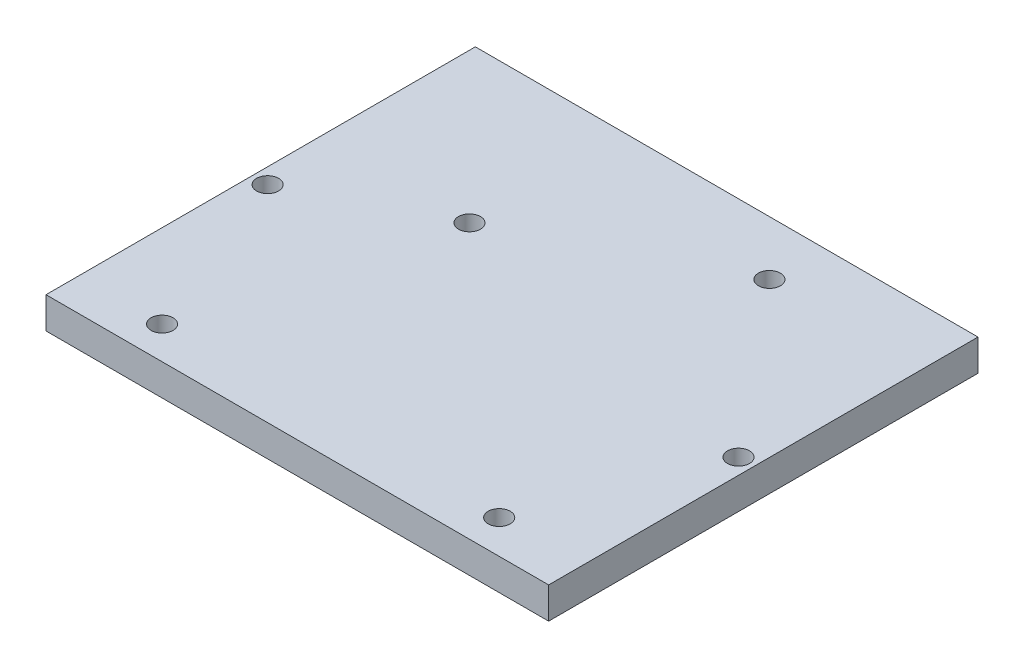
ISO-10303-21;
HEADER;
FILE_DESCRIPTION(('STEP AP214'),'2;1');
FILE_NAME('part.step','',(''),(''),'','','');
FILE_SCHEMA(('AUTOMOTIVE_DESIGN { 1 0 10303 214 1 1 1 1 }'));
ENDSEC;
DATA;
#1=APPLICATION_CONTEXT('core data for automotive mechanical design processes');
#2=APPLICATION_PROTOCOL_DEFINITION('international standard','automotive_design',2000,#1);
#3=PRODUCT_CONTEXT('',#1,'mechanical');
#4=PRODUCT('Part','Part','',(#3));
#5=PRODUCT_RELATED_PRODUCT_CATEGORY('part','',(#4));
#6=PRODUCT_DEFINITION_FORMATION('','',#4);
#7=PRODUCT_DEFINITION_CONTEXT('part definition',#1,'design');
#8=PRODUCT_DEFINITION('design','',#6,#7);
#9=PRODUCT_DEFINITION_SHAPE('','',#8);
#10=(LENGTH_UNIT() NAMED_UNIT(*) SI_UNIT(.MILLI.,.METRE.));
#11=(NAMED_UNIT(*) PLANE_ANGLE_UNIT() SI_UNIT($,.RADIAN.));
#12=(NAMED_UNIT(*) SI_UNIT($,.STERADIAN.) SOLID_ANGLE_UNIT());
#13=UNCERTAINTY_MEASURE_WITH_UNIT(LENGTH_MEASURE(1.E-05),#10,'distance_accuracy_value','');
#14=(GEOMETRIC_REPRESENTATION_CONTEXT(3) GLOBAL_UNCERTAINTY_ASSIGNED_CONTEXT((#13)) GLOBAL_UNIT_ASSIGNED_CONTEXT((#10,
#11,#12)) REPRESENTATION_CONTEXT('',''));
#15=CARTESIAN_POINT('',(0.,0.,0.));
#16=DIRECTION('',(0.,0.,1.));
#17=DIRECTION('',(1.,0.,0.));
#18=AXIS2_PLACEMENT_3D('',#15,#16,#17);
#19=CARTESIAN_POINT('',(0.,3.,0.));
#20=DIRECTION('',(0.,-1.,0.));
#21=DIRECTION('',(0.,0.,-1.));
#22=AXIS2_PLACEMENT_3D('',#19,#20,#21);
#23=PLANE('',#22);
#24=DIRECTION('',(0.,0.,1.));
#25=VECTOR('',#24,1.);
#26=CARTESIAN_POINT('',(0.,3.,0.));
#27=LINE('',#26,#25);
#28=CARTESIAN_POINT('',(0.,3.,-41.));
#29=VERTEX_POINT('',#28);
#30=CARTESIAN_POINT('',(0.,3.,0.));
#31=VERTEX_POINT('',#30);
#32=EDGE_CURVE('E92',#29,#31,#27,.T.);
#33=ORIENTED_EDGE('',*,*,#32,.T.);
#34=DIRECTION('',(1.,0.,0.));
#35=VECTOR('',#34,1.);
#36=CARTESIAN_POINT('',(0.,3.,0.));
#37=LINE('',#36,#35);
#38=CARTESIAN_POINT('',(48.,3.,0.));
#39=VERTEX_POINT('',#38);
#40=EDGE_CURVE('E87',#31,#39,#37,.T.);
#41=ORIENTED_EDGE('',*,*,#40,.T.);
#42=DIRECTION('',(0.,0.,-1.));
#43=VECTOR('',#42,1.);
#44=CARTESIAN_POINT('',(48.,3.,0.));
#45=LINE('',#44,#43);
#46=CARTESIAN_POINT('',(48.,3.,-41.));
#47=VERTEX_POINT('',#46);
#48=EDGE_CURVE('E90',#39,#47,#45,.T.);
#49=ORIENTED_EDGE('',*,*,#48,.T.);
#50=DIRECTION('',(-1.,0.,0.));
#51=VECTOR('',#50,1.);
#52=CARTESIAN_POINT('',(0.,3.,-41.));
#53=LINE('',#52,#51);
#54=EDGE_CURVE('E57',#47,#29,#53,.T.);
#55=ORIENTED_EDGE('',*,*,#54,.T.);
#56=EDGE_LOOP('',(#33,#41,#49,#55));
#57=FACE_BOUND('',#56,.T.);
#58=CARTESIAN_POINT('',(7.97,3.,-3.11));
#59=DIRECTION('',(0.,1.,0.));
#60=DIRECTION('',(0.,0.,1.));
#61=AXIS2_PLACEMENT_3D('',#58,#59,#60);
#62=CIRCLE('',#61,1.05);
#63=CARTESIAN_POINT('',(7.97,3.,-2.06));
#64=VERTEX_POINT('',#63);
#65=EDGE_CURVE('E112',#64,#64,#62,.T.);
#66=ORIENTED_EDGE('',*,*,#65,.F.);
#67=EDGE_LOOP('',(#66));
#68=FACE_BOUND('',#67,.T.);
#69=CARTESIAN_POINT('',(1.48,3.,-19.68));
#70=DIRECTION('',(0.,1.,0.));
#71=DIRECTION('',(0.,0.,1.));
#72=AXIS2_PLACEMENT_3D('',#69,#70,#71);
#73=CIRCLE('',#72,1.05);
#74=CARTESIAN_POINT('',(1.48,3.,-18.63));
#75=VERTEX_POINT('',#74);
#76=EDGE_CURVE('E134',#75,#75,#73,.T.);
#77=ORIENTED_EDGE('',*,*,#76,.F.);
#78=EDGE_LOOP('',(#77));
#79=FACE_BOUND('',#78,.T.);
#80=CARTESIAN_POINT('',(14.28,3.,-26.16));
#81=DIRECTION('',(0.,1.,0.));
#82=DIRECTION('',(0.,0.,1.));
#83=AXIS2_PLACEMENT_3D('',#80,#81,#82);
#84=CIRCLE('',#83,1.05);
#85=CARTESIAN_POINT('',(14.28,3.,-25.11));
#86=VERTEX_POINT('',#85);
#87=EDGE_CURVE('E142',#86,#86,#84,.T.);
#88=ORIENTED_EDGE('',*,*,#87,.F.);
#89=EDGE_LOOP('',(#88));
#90=FACE_BOUND('',#89,.T.);
#91=CARTESIAN_POINT('',(40.07,3.,-3.21));
#92=DIRECTION('',(0.,1.,0.));
#93=DIRECTION('',(0.,0.,1.));
#94=AXIS2_PLACEMENT_3D('',#91,#92,#93);
#95=CIRCLE('',#94,1.05);
#96=CARTESIAN_POINT('',(40.07,3.,-2.16));
#97=VERTEX_POINT('',#96);
#98=EDGE_CURVE('E150',#97,#97,#95,.T.);
#99=ORIENTED_EDGE('',*,*,#98,.F.);
#100=EDGE_LOOP('',(#99));
#101=FACE_BOUND('',#100,.T.);
#102=CARTESIAN_POINT('',(46.5,3.,-19.63));
#103=DIRECTION('',(0.,1.,0.));
#104=DIRECTION('',(0.,0.,1.));
#105=AXIS2_PLACEMENT_3D('',#102,#103,#104);
#106=CIRCLE('',#105,1.05);
#107=CARTESIAN_POINT('',(46.5,3.,-18.58));
#108=VERTEX_POINT('',#107);
#109=EDGE_CURVE('E158',#108,#108,#106,.T.);
#110=ORIENTED_EDGE('',*,*,#109,.F.);
#111=EDGE_LOOP('',(#110));
#112=FACE_BOUND('',#111,.T.);
#113=CARTESIAN_POINT('',(33.28,3.,-35.8));
#114=DIRECTION('',(0.,1.,0.));
#115=DIRECTION('',(0.,0.,1.));
#116=AXIS2_PLACEMENT_3D('',#113,#114,#115);
#117=CIRCLE('',#116,1.05);
#118=CARTESIAN_POINT('',(33.28,3.,-34.75));
#119=VERTEX_POINT('',#118);
#120=EDGE_CURVE('E166',#119,#119,#117,.T.);
#121=ORIENTED_EDGE('',*,*,#120,.F.);
#122=EDGE_LOOP('',(#121));
#123=FACE_BOUND('',#122,.T.);
#124=ADVANCED_FACE('F39',(#57,#68,#79,#90,#101,#112,#123),#23,.F.);
#125=CARTESIAN_POINT('',(0.,0.,0.));
#126=DIRECTION('',(0.,-1.,0.));
#127=DIRECTION('',(0.,0.,-1.));
#128=AXIS2_PLACEMENT_3D('',#125,#126,#127);
#129=PLANE('',#128);
#130=CARTESIAN_POINT('',(46.5,0.,-19.63));
#131=DIRECTION('',(0.,1.,0.));
#132=DIRECTION('',(0.,0.,1.));
#133=AXIS2_PLACEMENT_3D('',#130,#131,#132);
#134=CIRCLE('',#133,1.05);
#135=CARTESIAN_POINT('',(46.5,0.,-18.58));
#136=VERTEX_POINT('',#135);
#137=EDGE_CURVE('E162',#136,#136,#134,.T.);
#138=ORIENTED_EDGE('',*,*,#137,.T.);
#139=EDGE_LOOP('',(#138));
#140=FACE_BOUND('',#139,.T.);
#141=CARTESIAN_POINT('',(14.28,0.,-26.16));
#142=DIRECTION('',(0.,1.,0.));
#143=DIRECTION('',(0.,0.,1.));
#144=AXIS2_PLACEMENT_3D('',#141,#142,#143);
#145=CIRCLE('',#144,1.05);
#146=CARTESIAN_POINT('',(14.28,0.,-25.11));
#147=VERTEX_POINT('',#146);
#148=EDGE_CURVE('E146',#147,#147,#145,.T.);
#149=ORIENTED_EDGE('',*,*,#148,.T.);
#150=EDGE_LOOP('',(#149));
#151=FACE_BOUND('',#150,.T.);
#152=CARTESIAN_POINT('',(7.97,0.,-3.11));
#153=DIRECTION('',(0.,1.,0.));
#154=DIRECTION('',(0.,0.,1.));
#155=AXIS2_PLACEMENT_3D('',#152,#153,#154);
#156=CIRCLE('',#155,1.05);
#157=CARTESIAN_POINT('',(7.97,0.,-2.06));
#158=VERTEX_POINT('',#157);
#159=EDGE_CURVE('E130',#158,#158,#156,.T.);
#160=ORIENTED_EDGE('',*,*,#159,.T.);
#161=EDGE_LOOP('',(#160));
#162=FACE_BOUND('',#161,.T.);
#163=DIRECTION('',(0.,0.,1.));
#164=VECTOR('',#163,1.);
#165=CARTESIAN_POINT('',(0.,0.,0.));
#166=LINE('',#165,#164);
#167=CARTESIAN_POINT('',(0.,0.,-41.));
#168=VERTEX_POINT('',#167);
#169=CARTESIAN_POINT('',(0.,0.,0.));
#170=VERTEX_POINT('',#169);
#171=EDGE_CURVE('E108',#168,#170,#166,.T.);
#172=ORIENTED_EDGE('',*,*,#171,.F.);
#173=DIRECTION('',(-1.,0.,0.));
#174=VECTOR('',#173,1.);
#175=CARTESIAN_POINT('',(0.,0.,-41.));
#176=LINE('',#175,#174);
#177=CARTESIAN_POINT('',(48.,0.,-41.));
#178=VERTEX_POINT('',#177);
#179=EDGE_CURVE('E80',#178,#168,#176,.T.);
#180=ORIENTED_EDGE('',*,*,#179,.F.);
#181=DIRECTION('',(0.,0.,-1.));
#182=VECTOR('',#181,1.);
#183=CARTESIAN_POINT('',(48.,0.,0.));
#184=LINE('',#183,#182);
#185=CARTESIAN_POINT('',(48.,0.,0.));
#186=VERTEX_POINT('',#185);
#187=EDGE_CURVE('E74',#186,#178,#184,.T.);
#188=ORIENTED_EDGE('',*,*,#187,.F.);
#189=DIRECTION('',(1.,0.,0.));
#190=VECTOR('',#189,1.);
#191=CARTESIAN_POINT('',(0.,0.,0.));
#192=LINE('',#191,#190);
#193=EDGE_CURVE('E97',#170,#186,#192,.T.);
#194=ORIENTED_EDGE('',*,*,#193,.F.);
#195=EDGE_LOOP('',(#172,#180,#188,#194));
#196=FACE_BOUND('',#195,.T.);
#197=CARTESIAN_POINT('',(1.48,0.,-19.68));
#198=DIRECTION('',(0.,1.,0.));
#199=DIRECTION('',(0.,0.,1.));
#200=AXIS2_PLACEMENT_3D('',#197,#198,#199);
#201=CIRCLE('',#200,1.05);
#202=CARTESIAN_POINT('',(1.48,0.,-18.63));
#203=VERTEX_POINT('',#202);
#204=EDGE_CURVE('E138',#203,#203,#201,.T.);
#205=ORIENTED_EDGE('',*,*,#204,.T.);
#206=EDGE_LOOP('',(#205));
#207=FACE_BOUND('',#206,.T.);
#208=CARTESIAN_POINT('',(40.07,0.,-3.21));
#209=DIRECTION('',(0.,1.,0.));
#210=DIRECTION('',(0.,0.,1.));
#211=AXIS2_PLACEMENT_3D('',#208,#209,#210);
#212=CIRCLE('',#211,1.05);
#213=CARTESIAN_POINT('',(40.07,0.,-2.16));
#214=VERTEX_POINT('',#213);
#215=EDGE_CURVE('E154',#214,#214,#212,.T.);
#216=ORIENTED_EDGE('',*,*,#215,.T.);
#217=EDGE_LOOP('',(#216));
#218=FACE_BOUND('',#217,.T.);
#219=CARTESIAN_POINT('',(33.28,0.,-35.8));
#220=DIRECTION('',(0.,1.,0.));
#221=DIRECTION('',(0.,0.,1.));
#222=AXIS2_PLACEMENT_3D('',#219,#220,#221);
#223=CIRCLE('',#222,1.05);
#224=CARTESIAN_POINT('',(33.28,0.,-34.75));
#225=VERTEX_POINT('',#224);
#226=EDGE_CURVE('E170',#225,#225,#223,.T.);
#227=ORIENTED_EDGE('',*,*,#226,.T.);
#228=EDGE_LOOP('',(#227));
#229=FACE_BOUND('',#228,.T.);
#230=ADVANCED_FACE('F125',(#140,#151,#162,#196,#207,#218,#229),#129,.T.);
#231=CARTESIAN_POINT('',(0.,3.,0.));
#232=DIRECTION('',(1.,0.,0.));
#233=DIRECTION('',(0.,0.,-1.));
#234=AXIS2_PLACEMENT_3D('',#231,#232,#233);
#235=PLANE('',#234);
#236=ORIENTED_EDGE('',*,*,#171,.T.);
#237=DIRECTION('',(0.,-1.,0.));
#238=VECTOR('',#237,1.);
#239=CARTESIAN_POINT('',(0.,3.,0.));
#240=LINE('',#239,#238);
#241=EDGE_CURVE('E11',#31,#170,#240,.T.);
#242=ORIENTED_EDGE('',*,*,#241,.F.);
#243=ORIENTED_EDGE('',*,*,#32,.F.);
#244=DIRECTION('',(0.,-1.,0.));
#245=VECTOR('',#244,1.);
#246=CARTESIAN_POINT('',(0.,3.,-41.));
#247=LINE('',#246,#245);
#248=EDGE_CURVE('E104',#29,#168,#247,.T.);
#249=ORIENTED_EDGE('',*,*,#248,.T.);
#250=EDGE_LOOP('',(#236,#242,#243,#249));
#251=FACE_BOUND('',#250,.T.);
#252=ADVANCED_FACE('F41',(#251),#235,.F.);
#253=CARTESIAN_POINT('',(0.,3.,0.));
#254=DIRECTION('',(0.,0.,-1.));
#255=DIRECTION('',(-1.,0.,0.));
#256=AXIS2_PLACEMENT_3D('',#253,#254,#255);
#257=PLANE('',#256);
#258=ORIENTED_EDGE('',*,*,#193,.T.);
#259=DIRECTION('',(0.,-1.,0.));
#260=VECTOR('',#259,1.);
#261=CARTESIAN_POINT('',(48.,3.,0.));
#262=LINE('',#261,#260);
#263=EDGE_CURVE('E49',#39,#186,#262,.T.);
#264=ORIENTED_EDGE('',*,*,#263,.F.);
#265=ORIENTED_EDGE('',*,*,#40,.F.);
#266=ORIENTED_EDGE('',*,*,#241,.T.);
#267=EDGE_LOOP('',(#258,#264,#265,#266));
#268=FACE_BOUND('',#267,.T.);
#269=ADVANCED_FACE('F96',(#268),#257,.F.);
#270=CARTESIAN_POINT('',(48.,3.,0.));
#271=DIRECTION('',(-1.,0.,0.));
#272=DIRECTION('',(0.,0.,1.));
#273=AXIS2_PLACEMENT_3D('',#270,#271,#272);
#274=PLANE('',#273);
#275=ORIENTED_EDGE('',*,*,#187,.T.);
#276=DIRECTION('',(0.,-1.,0.));
#277=VECTOR('',#276,1.);
#278=CARTESIAN_POINT('',(48.,3.,-41.));
#279=LINE('',#278,#277);
#280=EDGE_CURVE('E99',#47,#178,#279,.T.);
#281=ORIENTED_EDGE('',*,*,#280,.F.);
#282=ORIENTED_EDGE('',*,*,#48,.F.);
#283=ORIENTED_EDGE('',*,*,#263,.T.);
#284=EDGE_LOOP('',(#275,#281,#282,#283));
#285=FACE_BOUND('',#284,.T.);
#286=ADVANCED_FACE('F100',(#285),#274,.F.);
#287=CARTESIAN_POINT('',(0.,3.,-41.));
#288=DIRECTION('',(0.,0.,1.));
#289=DIRECTION('',(1.,0.,0.));
#290=AXIS2_PLACEMENT_3D('',#287,#288,#289);
#291=PLANE('',#290);
#292=ORIENTED_EDGE('',*,*,#179,.T.);
#293=ORIENTED_EDGE('',*,*,#248,.F.);
#294=ORIENTED_EDGE('',*,*,#54,.F.);
#295=ORIENTED_EDGE('',*,*,#280,.T.);
#296=EDGE_LOOP('',(#292,#293,#294,#295));
#297=FACE_BOUND('',#296,.T.);
#298=ADVANCED_FACE('F122',(#297),#291,.F.);
#299=CARTESIAN_POINT('',(7.97,3.,-3.11));
#300=DIRECTION('',(0.,-1.,0.));
#301=DIRECTION('',(0.,0.,-1.));
#302=AXIS2_PLACEMENT_3D('',#299,#300,#301);
#303=CYLINDRICAL_SURFACE('',#302,1.05);
#304=ORIENTED_EDGE('',*,*,#65,.T.);
#305=EDGE_LOOP('',(#304));
#306=FACE_BOUND('',#305,.T.);
#307=ORIENTED_EDGE('',*,*,#159,.F.);
#308=EDGE_LOOP('',(#307));
#309=FACE_BOUND('',#308,.T.);
#310=ADVANCED_FACE('F189',(#306,#309),#303,.F.);
#311=CARTESIAN_POINT('',(1.48,3.,-19.68));
#312=DIRECTION('',(0.,-1.,0.));
#313=DIRECTION('',(0.,0.,-1.));
#314=AXIS2_PLACEMENT_3D('',#311,#312,#313);
#315=CYLINDRICAL_SURFACE('',#314,1.05);
#316=ORIENTED_EDGE('',*,*,#76,.T.);
#317=EDGE_LOOP('',(#316));
#318=FACE_BOUND('',#317,.T.);
#319=ORIENTED_EDGE('',*,*,#204,.F.);
#320=EDGE_LOOP('',(#319));
#321=FACE_BOUND('',#320,.T.);
#322=ADVANCED_FACE('F235',(#318,#321),#315,.F.);
#323=CARTESIAN_POINT('',(14.28,3.,-26.16));
#324=DIRECTION('',(0.,-1.,0.));
#325=DIRECTION('',(0.,0.,-1.));
#326=AXIS2_PLACEMENT_3D('',#323,#324,#325);
#327=CYLINDRICAL_SURFACE('',#326,1.05);
#328=ORIENTED_EDGE('',*,*,#87,.T.);
#329=EDGE_LOOP('',(#328));
#330=FACE_BOUND('',#329,.T.);
#331=ORIENTED_EDGE('',*,*,#148,.F.);
#332=EDGE_LOOP('',(#331));
#333=FACE_BOUND('',#332,.T.);
#334=ADVANCED_FACE('F243',(#330,#333),#327,.F.);
#335=CARTESIAN_POINT('',(40.07,3.,-3.21));
#336=DIRECTION('',(0.,-1.,0.));
#337=DIRECTION('',(0.,0.,-1.));
#338=AXIS2_PLACEMENT_3D('',#335,#336,#337);
#339=CYLINDRICAL_SURFACE('',#338,1.05);
#340=ORIENTED_EDGE('',*,*,#98,.T.);
#341=EDGE_LOOP('',(#340));
#342=FACE_BOUND('',#341,.T.);
#343=ORIENTED_EDGE('',*,*,#215,.F.);
#344=EDGE_LOOP('',(#343));
#345=FACE_BOUND('',#344,.T.);
#346=ADVANCED_FACE('F251',(#342,#345),#339,.F.);
#347=CARTESIAN_POINT('',(46.5,3.,-19.63));
#348=DIRECTION('',(0.,-1.,0.));
#349=DIRECTION('',(0.,0.,-1.));
#350=AXIS2_PLACEMENT_3D('',#347,#348,#349);
#351=CYLINDRICAL_SURFACE('',#350,1.05);
#352=ORIENTED_EDGE('',*,*,#109,.T.);
#353=EDGE_LOOP('',(#352));
#354=FACE_BOUND('',#353,.T.);
#355=ORIENTED_EDGE('',*,*,#137,.F.);
#356=EDGE_LOOP('',(#355));
#357=FACE_BOUND('',#356,.T.);
#358=ADVANCED_FACE('F260',(#354,#357),#351,.F.);
#359=CARTESIAN_POINT('',(33.28,3.,-35.8));
#360=DIRECTION('',(0.,-1.,0.));
#361=DIRECTION('',(0.,0.,-1.));
#362=AXIS2_PLACEMENT_3D('',#359,#360,#361);
#363=CYLINDRICAL_SURFACE('',#362,1.05);
#364=ORIENTED_EDGE('',*,*,#120,.T.);
#365=EDGE_LOOP('',(#364));
#366=FACE_BOUND('',#365,.T.);
#367=ORIENTED_EDGE('',*,*,#226,.F.);
#368=EDGE_LOOP('',(#367));
#369=FACE_BOUND('',#368,.T.);
#370=ADVANCED_FACE('F178',(#366,#369),#363,.F.);
#371=CLOSED_SHELL('',(#124,#230,#252,#269,#286,#298,#310,#322,#334,#346,#358,#370));
#372=MANIFOLD_SOLID_BREP('B2',#371);
#373=ADVANCED_BREP_SHAPE_REPRESENTATION('',(#18,#372),#14);
#374=SHAPE_DEFINITION_REPRESENTATION(#9,#373);
ENDSEC;
END-ISO-10303-21;
